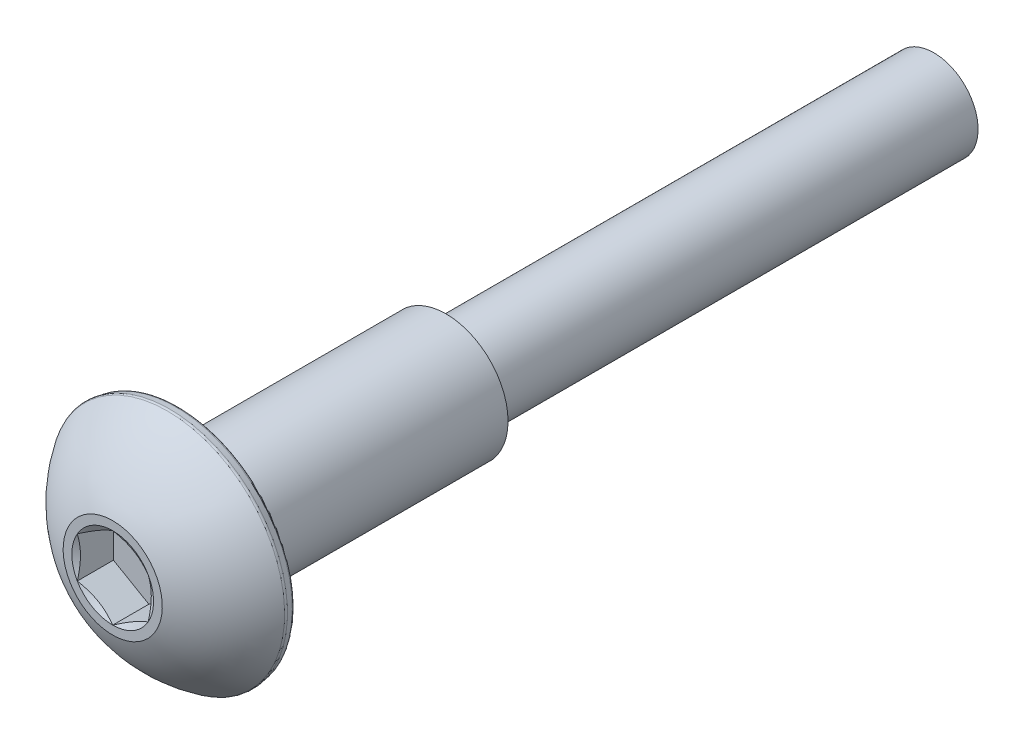
ISO-10303-21;
HEADER;
FILE_DESCRIPTION(('STEP AP214'),'2;1');
FILE_NAME('part.step','',(''),(''),'','','');
FILE_SCHEMA(('AUTOMOTIVE_DESIGN { 1 0 10303 214 1 1 1 1 }'));
ENDSEC;
DATA;
#1=APPLICATION_CONTEXT('core data for automotive mechanical design processes');
#2=APPLICATION_PROTOCOL_DEFINITION('international standard','automotive_design',2000,#1);
#3=PRODUCT_CONTEXT('',#1,'mechanical');
#4=PRODUCT('Part','Part','',(#3));
#5=PRODUCT_RELATED_PRODUCT_CATEGORY('part','',(#4));
#6=PRODUCT_DEFINITION_FORMATION('','',#4);
#7=PRODUCT_DEFINITION_CONTEXT('part definition',#1,'design');
#8=PRODUCT_DEFINITION('design','',#6,#7);
#9=PRODUCT_DEFINITION_SHAPE('','',#8);
#10=(LENGTH_UNIT() NAMED_UNIT(*) SI_UNIT(.MILLI.,.METRE.));
#11=(NAMED_UNIT(*) PLANE_ANGLE_UNIT() SI_UNIT($,.RADIAN.));
#12=(NAMED_UNIT(*) SI_UNIT($,.STERADIAN.) SOLID_ANGLE_UNIT());
#13=UNCERTAINTY_MEASURE_WITH_UNIT(LENGTH_MEASURE(1.E-05),#10,'distance_accuracy_value','');
#14=(GEOMETRIC_REPRESENTATION_CONTEXT(3) GLOBAL_UNCERTAINTY_ASSIGNED_CONTEXT((#13)) GLOBAL_UNIT_ASSIGNED_CONTEXT((#10,
#11,#12)) REPRESENTATION_CONTEXT('',''));
#15=CARTESIAN_POINT('',(0.,0.,0.));
#16=DIRECTION('',(0.,0.,1.));
#17=DIRECTION('',(1.,0.,0.));
#18=AXIS2_PLACEMENT_3D('',#15,#16,#17);
#19=CARTESIAN_POINT('',(0.,0.,13.8049));
#20=DIRECTION('',(0.,0.,1.));
#21=DIRECTION('',(1.,0.,0.));
#22=AXIS2_PLACEMENT_3D('',#19,#20,#21);
#23=CYLINDRICAL_SURFACE('',#22,2.0828);
#24=CARTESIAN_POINT('',(0.,0.,11.5091740419683));
#25=DIRECTION('',(0.,0.,1.));
#26=DIRECTION('',(1.,0.,0.));
#27=AXIS2_PLACEMENT_3D('',#24,#25,#26);
#28=CIRCLE('',#27,2.0828);
#29=CARTESIAN_POINT('',(2.0828,0.,11.5091740419683));
#30=VERTEX_POINT('',#29);
#31=EDGE_CURVE('E12',#30,#30,#28,.F.);
#32=ORIENTED_EDGE('',*,*,#31,.T.);
#33=EDGE_LOOP('',(#32));
#34=FACE_BOUND('',#33,.T.);
#35=CARTESIAN_POINT('',(0.,0.,2.5951));
#36=DIRECTION('',(0.,0.,-1.));
#37=DIRECTION('',(-1.,0.,0.));
#38=AXIS2_PLACEMENT_3D('',#35,#36,#37);
#39=CIRCLE('',#38,2.0828);
#40=CARTESIAN_POINT('',(-2.0828,0.,2.5951));
#41=VERTEX_POINT('',#40);
#42=EDGE_CURVE('E52',#41,#41,#39,.T.);
#43=ORIENTED_EDGE('',*,*,#42,.F.);
#44=EDGE_LOOP('',(#43));
#45=FACE_BOUND('',#44,.T.);
#46=ADVANCED_FACE('F48',(#34,#45),#23,.T.);
#47=CARTESIAN_POINT('',(0.,0.,11.5951));
#48=DIRECTION('',(0.,0.,1.));
#49=DIRECTION('',(-1.,0.,0.));
#50=AXIS2_PLACEMENT_3D('',#47,#48,#49);
#51=CONICAL_SURFACE('',#50,2.16872595803173,0.78539816339745);
#52=CARTESIAN_POINT('',(0.,0.,11.5951));
#53=DIRECTION('',(0.,0.,-1.));
#54=DIRECTION('',(-1.,0.,0.));
#55=AXIS2_PLACEMENT_3D('',#52,#53,#54);
#56=CIRCLE('',#55,2.16872595803173);
#57=CARTESIAN_POINT('',(-2.16872595803173,0.,11.5951));
#58=VERTEX_POINT('',#57);
#59=EDGE_CURVE('E300',#58,#58,#56,.T.);
#60=ORIENTED_EDGE('',*,*,#59,.T.);
#61=EDGE_LOOP('',(#60));
#62=FACE_BOUND('',#61,.T.);
#63=ORIENTED_EDGE('',*,*,#31,.F.);
#64=EDGE_LOOP('',(#63));
#65=FACE_BOUND('',#64,.T.);
#66=ADVANCED_FACE('F212',(#62,#65),#51,.T.);
#67=CARTESIAN_POINT('',(3.81124077745579,0.,11.5951));
#68=DIRECTION('',(0.,0.,-1.));
#69=DIRECTION('',(-1.,0.,0.));
#70=AXIS2_PLACEMENT_3D('',#67,#68,#69);
#71=PLANE('',#70);
#72=ORIENTED_EDGE('',*,*,#59,.F.);
#73=EDGE_LOOP('',(#72));
#74=FACE_BOUND('',#73,.T.);
#75=CARTESIAN_POINT('',(0.,0.,11.5951));
#76=DIRECTION('',(0.,0.,1.));
#77=DIRECTION('',(1.,0.,0.));
#78=AXIS2_PLACEMENT_3D('',#75,#76,#77);
#79=CIRCLE('',#78,3.81124077745579);
#80=CARTESIAN_POINT('',(3.81124077745579,0.,11.5951));
#81=VERTEX_POINT('',#80);
#82=EDGE_CURVE('E297',#81,#81,#79,.F.);
#83=ORIENTED_EDGE('',*,*,#82,.T.);
#84=EDGE_LOOP('',(#83));
#85=FACE_BOUND('',#84,.T.);
#86=ADVANCED_FACE('F50',(#74,#85),#71,.T.);
#87=CARTESIAN_POINT('',(0.,0.,12.58951));
#88=DIRECTION('',(0.,0.,1.));
#89=DIRECTION('',(1.,0.,0.));
#90=AXIS2_PLACEMENT_3D('',#87,#88,#89);
#91=PLANE('',#90);
#92=DIRECTION('',(0.,-1.,0.));
#93=VECTOR('',#92,1.);
#94=CARTESIAN_POINT('',(-1.190625,0.687407664253899,12.58951));
#95=LINE('',#94,#93);
#96=CARTESIAN_POINT('',(-1.190625,0.687407664253899,12.58951));
#97=VERTEX_POINT('',#96);
#98=CARTESIAN_POINT('',(-1.190625,-0.687407664253897,12.58951));
#99=VERTEX_POINT('',#98);
#100=EDGE_CURVE('E284',#97,#99,#95,.T.);
#101=ORIENTED_EDGE('',*,*,#100,.T.);
#102=DIRECTION('',(0.866025403784439,-0.5,0.));
#103=VECTOR('',#102,1.);
#104=CARTESIAN_POINT('',(-1.190625,-0.687407664253897,12.58951));
#105=LINE('',#104,#103);
#106=CARTESIAN_POINT('',(0.,-1.37481532850779,12.58951));
#107=VERTEX_POINT('',#106);
#108=EDGE_CURVE('E254',#99,#107,#105,.T.);
#109=ORIENTED_EDGE('',*,*,#108,.T.);
#110=DIRECTION('',(0.866025403784439,0.5,0.));
#111=VECTOR('',#110,1.);
#112=CARTESIAN_POINT('',(0.,-1.37481532850779,12.58951));
#113=LINE('',#112,#111);
#114=CARTESIAN_POINT('',(1.190625,-0.687407664253896,12.58951));
#115=VERTEX_POINT('',#114);
#116=EDGE_CURVE('E282',#107,#115,#113,.T.);
#117=ORIENTED_EDGE('',*,*,#116,.T.);
#118=DIRECTION('',(0.,1.,0.));
#119=VECTOR('',#118,1.);
#120=CARTESIAN_POINT('',(1.190625,-0.687407664253896,12.58951));
#121=LINE('',#120,#119);
#122=CARTESIAN_POINT('',(1.190625,0.6874076642539,12.58951));
#123=VERTEX_POINT('',#122);
#124=EDGE_CURVE('E270',#115,#123,#121,.T.);
#125=ORIENTED_EDGE('',*,*,#124,.T.);
#126=DIRECTION('',(-0.866025403784439,0.5,0.));
#127=VECTOR('',#126,1.);
#128=CARTESIAN_POINT('',(1.190625,0.6874076642539,12.58951));
#129=LINE('',#128,#127);
#130=CARTESIAN_POINT('',(0.,1.3748153285078,12.58951));
#131=VERTEX_POINT('',#130);
#132=EDGE_CURVE('E279',#123,#131,#129,.T.);
#133=ORIENTED_EDGE('',*,*,#132,.T.);
#134=DIRECTION('',(-0.866025403784438,-0.5,0.));
#135=VECTOR('',#134,1.);
#136=CARTESIAN_POINT('',(0.,1.3748153285078,12.58951));
#137=LINE('',#136,#135);
#138=EDGE_CURVE('E138',#131,#97,#137,.T.);
#139=ORIENTED_EDGE('',*,*,#138,.T.);
#140=EDGE_LOOP('',(#101,#109,#117,#125,#133,#139));
#141=FACE_BOUND('',#140,.T.);
#142=ADVANCED_FACE('F166',(#141),#91,.T.);
#143=CARTESIAN_POINT('',(-1.190625,-0.687407664253897,12.58951));
#144=DIRECTION('',(-0.5,-0.866025403784439,0.));
#145=DIRECTION('',(0.866025403784439,-0.5,0.));
#146=AXIS2_PLACEMENT_3D('',#143,#144,#145);
#147=PLANE('',#146);
#148=DIRECTION('',(0.,0.,1.));
#149=VECTOR('',#148,1.);
#150=CARTESIAN_POINT('',(-1.190625,-0.687407664253897,12.58951));
#151=LINE('',#150,#149);
#152=CARTESIAN_POINT('',(-1.190625,-0.687407664253895,13.8049));
#153=VERTEX_POINT('',#152);
#154=EDGE_CURVE('E71',#99,#153,#151,.T.);
#155=ORIENTED_EDGE('',*,*,#154,.T.);
#156=CARTESIAN_POINT('',(-1.190825,-0.687292194200059,13.8049666750649));
#157=CARTESIAN_POINT('',(-1.13850086640794,-0.717501546814547,13.7875158911719));
#158=CARTESIAN_POINT('',(-1.08572507911365,-0.747971661815601,13.7716444802597));
#159=CARTESIAN_POINT('',(-0.979259451985808,-0.809439620297303,13.7439394897393));
#160=CARTESIAN_POINT('',(-0.92556771904163,-0.840438556765882,13.7321157133569));
#161=CARTESIAN_POINT('',(-0.818849729284477,-0.902052216879549,13.7137085267766));
#162=CARTESIAN_POINT('',(-0.765839901547055,-0.932657455193446,13.7070026367973));
#163=CARTESIAN_POINT('',(-0.659570550745402,-0.994012093485387,13.6989941608559));
#164=CARTESIAN_POINT('',(-0.606311414481165,-1.02476127014435,13.6976849464003));
#165=CARTESIAN_POINT('',(-0.506776071312109,-1.08222802731689,13.7003944946182));
#166=CARTESIAN_POINT('',(-0.460485037506222,-1.10895416814578,13.7037479670539));
#167=CARTESIAN_POINT('',(-0.368204585679171,-1.16223231184907,13.7143808803557));
#168=CARTESIAN_POINT('',(-0.322215487336752,-1.18878413015685,13.7216639607648));
#169=CARTESIAN_POINT('',(-0.22974444840945,-1.24217230937378,13.7398728190617));
#170=CARTESIAN_POINT('',(-0.183274224005286,-1.26900190594282,13.7508758583194));
#171=CARTESIAN_POINT('',(-0.091027254583136,-1.32226071857063,13.7758490907767));
#172=CARTESIAN_POINT('',(-0.0452493258233877,-1.34869061806301,13.7898134081649));
#173=CARTESIAN_POINT('',(0.000200000000000575,-1.37493079856163,13.8049666750649));
#174=B_SPLINE_CURVE_WITH_KNOTS('',3,(#156,#157,#158,#159,#160,#161,#162,#163,#164,#165,#166,
#167,#168,#169,#170,#171,#172,#173),.UNSPECIFIED.,.F.,.F.,(4,2,2,2,2,2,2,2,4),(0.,
0.188739408275265,0.377932755052259,0.562442610563904,0.746725773280442,0.907244981861691,
1.06791311672804,1.23214725548008,1.39605851764637),.UNSPECIFIED.);
#175=CARTESIAN_POINT('',(0.,-1.3748153285078,13.8049));
#176=VERTEX_POINT('',#175);
#177=EDGE_CURVE('E171',#153,#176,#174,.T.);
#178=ORIENTED_EDGE('',*,*,#177,.T.);
#179=DIRECTION('',(0.,0.,1.));
#180=VECTOR('',#179,1.);
#181=CARTESIAN_POINT('',(0.,-1.37481532850779,12.58951));
#182=LINE('',#181,#180);
#183=EDGE_CURVE('E256',#107,#176,#182,.T.);
#184=ORIENTED_EDGE('',*,*,#183,.F.);
#185=ORIENTED_EDGE('',*,*,#108,.F.);
#186=EDGE_LOOP('',(#155,#178,#184,#185));
#187=FACE_BOUND('',#186,.T.);
#188=ADVANCED_FACE('F208',(#187),#147,.F.);
#189=CARTESIAN_POINT('',(0.,-1.37481532850779,12.58951));
#190=DIRECTION('',(0.5,-0.866025403784438,0.));
#191=DIRECTION('',(0.866025403784439,0.5,0.));
#192=AXIS2_PLACEMENT_3D('',#189,#190,#191);
#193=PLANE('',#192);
#194=ORIENTED_EDGE('',*,*,#183,.T.);
#195=CARTESIAN_POINT('',(-0.000199999999999549,-1.37493079856163,13.8049666750649));
#196=CARTESIAN_POINT('',(0.0521241335920579,-1.34472144594714,13.7875158911719));
#197=CARTESIAN_POINT('',(0.10489992088635,-1.31425133094609,13.7716444802597));
#198=CARTESIAN_POINT('',(0.211365548014192,-1.25278337246439,13.7439394897393));
#199=CARTESIAN_POINT('',(0.265057280958371,-1.22178443599581,13.7321157133569));
#200=CARTESIAN_POINT('',(0.371775270715523,-1.16017077588214,13.7137085267766));
#201=CARTESIAN_POINT('',(0.424785098452945,-1.12956553756825,13.7070026367973));
#202=CARTESIAN_POINT('',(0.531054449254598,-1.0682108992763,13.6989941608559));
#203=CARTESIAN_POINT('',(0.584313585518835,-1.03746172261734,13.6976849464003));
#204=CARTESIAN_POINT('',(0.683848928687891,-0.979994965444803,13.7003944946182));
#205=CARTESIAN_POINT('',(0.730139962493778,-0.953268824615909,13.7037479670539));
#206=CARTESIAN_POINT('',(0.822420414320829,-0.899990680912621,13.7143808803557));
#207=CARTESIAN_POINT('',(0.868409512663248,-0.873438862604837,13.7216639607648));
#208=CARTESIAN_POINT('',(0.960880551590549,-0.820050683387915,13.7398728190617));
#209=CARTESIAN_POINT('',(1.00735077599471,-0.793221086818868,13.7508758583194));
#210=CARTESIAN_POINT('',(1.09959774541686,-0.739962274191063,13.7758490907767));
#211=CARTESIAN_POINT('',(1.14537567417661,-0.713532374698679,13.7898134081649));
#212=CARTESIAN_POINT('',(1.190825,-0.687292194200059,13.8049666750649));
#213=B_SPLINE_CURVE_WITH_KNOTS('',3,(#195,#196,#197,#198,#199,#200,#201,#202,#203,#204,#205,
#206,#207,#208,#209,#210,#211,#212),.UNSPECIFIED.,.F.,.F.,(4,2,2,2,2,2,2,2,4),(0.,
0.188739408275265,0.377932755052259,0.562442610563904,0.746725773280443,0.907244981861691,
1.06791311672804,1.23214725548008,1.39605851764637),.UNSPECIFIED.);
#214=CARTESIAN_POINT('',(1.190625,-0.687407664253895,13.8049));
#215=VERTEX_POINT('',#214);
#216=EDGE_CURVE('E115',#176,#215,#213,.T.);
#217=ORIENTED_EDGE('',*,*,#216,.T.);
#218=DIRECTION('',(0.,0.,1.));
#219=VECTOR('',#218,1.);
#220=CARTESIAN_POINT('',(1.190625,-0.687407664253896,12.58951));
#221=LINE('',#220,#219);
#222=EDGE_CURVE('E267',#115,#215,#221,.T.);
#223=ORIENTED_EDGE('',*,*,#222,.F.);
#224=ORIENTED_EDGE('',*,*,#116,.F.);
#225=EDGE_LOOP('',(#194,#217,#223,#224));
#226=FACE_BOUND('',#225,.T.);
#227=ADVANCED_FACE('F158',(#226),#193,.F.);
#228=CARTESIAN_POINT('',(1.190625,-0.687407664253896,12.58951));
#229=DIRECTION('',(1.,0.,0.));
#230=DIRECTION('',(0.,0.,-1.));
#231=AXIS2_PLACEMENT_3D('',#228,#229,#230);
#232=PLANE('',#231);
#233=ORIENTED_EDGE('',*,*,#222,.T.);
#234=CARTESIAN_POINT('',(1.190625,-1.78015716020704,14.2476163906554));
#235=CARTESIAN_POINT('',(1.190625,-1.72874189185983,14.2229488309547));
#236=CARTESIAN_POINT('',(1.190625,-1.6772013389923,14.1985381585061));
#237=CARTESIAN_POINT('',(1.190625,-1.57380296646993,14.1503745833137));
#238=CARTESIAN_POINT('',(1.190625,-1.52194509174156,14.126621798946));
#239=CARTESIAN_POINT('',(1.190625,-1.41754804002314,14.0797852949331));
#240=CARTESIAN_POINT('',(1.190625,-1.36500663843256,14.0567065078844));
#241=CARTESIAN_POINT('',(1.190625,-1.25948270070628,14.0115892442043));
#242=CARTESIAN_POINT('',(1.190625,-1.2065001876767,13.9895507134811));
#243=CARTESIAN_POINT('',(1.190625,-1.04398470146779,13.9242514369833));
#244=CARTESIAN_POINT('',(1.190625,-0.933604354597384,13.8830585999003));
#245=CARTESIAN_POINT('',(1.190625,-0.710006074690722,13.8097509566151));
#246=CARTESIAN_POINT('',(1.190625,-0.596796359427704,13.7776125823328));
#247=CARTESIAN_POINT('',(1.190625,-0.424696051876902,13.7403391876118));
#248=CARTESIAN_POINT('',(1.190625,-0.367003246478022,13.7297418918806));
#249=CARTESIAN_POINT('',(1.190625,-0.250970459440639,13.7129152301313));
#250=CARTESIAN_POINT('',(1.190625,-0.192630521807337,13.7066855689398));
#251=CARTESIAN_POINT('',(1.190625,-0.0763262925494509,13.6991712860207));
#252=CARTESIAN_POINT('',(1.190625,-0.0183658752538224,13.697828309312));
#253=CARTESIAN_POINT('',(1.190625,0.0974591062929192,13.7000451833237));
#254=CARTESIAN_POINT('',(1.190625,0.155323664386659,13.703605337629));
#255=CARTESIAN_POINT('',(1.190625,0.298095905598661,13.7181253650142));
#256=CARTESIAN_POINT('',(1.190625,0.382726930762759,13.731806337346));
#257=CARTESIAN_POINT('',(1.190625,0.550343213783404,13.7670856083292));
#258=CARTESIAN_POINT('',(1.190625,0.633326360497146,13.7886934492585));
#259=CARTESIAN_POINT('',(1.190625,0.757436785616911,13.8256049239269));
#260=CARTESIAN_POINT('',(1.190625,0.79920560365277,13.8388308547387));
#261=CARTESIAN_POINT('',(1.190625,0.882308453068416,13.8665061905507));
#262=CARTESIAN_POINT('',(1.190625,0.923642737930447,13.8809548320084));
#263=CARTESIAN_POINT('',(1.190625,1.00593175891306,13.9108657525345));
#264=CARTESIAN_POINT('',(1.190625,1.04688656247483,13.92632784739));
#265=CARTESIAN_POINT('',(1.190625,1.12847345966589,13.9580984272925));
#266=CARTESIAN_POINT('',(1.190625,1.1691054974264,13.9744070553403));
#267=CARTESIAN_POINT('',(1.190625,1.27282063071651,14.0170802730663));
#268=CARTESIAN_POINT('',(1.190625,1.33569634158372,14.043948362068));
#269=CARTESIAN_POINT('',(1.190625,1.46087997208419,14.0989797400025));
#270=CARTESIAN_POINT('',(1.190625,1.52318784876136,14.1271431259645));
#271=CARTESIAN_POINT('',(1.190625,1.70944892885062,14.2131196214873));
#272=CARTESIAN_POINT('',(1.190625,1.83271877672913,14.2724102543263));
#273=CARTESIAN_POINT('',(1.190625,2.07820533773844,14.3934781590678));
#274=CARTESIAN_POINT('',(1.190625,2.20042056990702,14.4552583983021));
#275=CARTESIAN_POINT('',(1.190625,2.44401368474694,14.5804074444787));
#276=CARTESIAN_POINT('',(1.190625,2.56539167137775,14.6437760494975));
#277=CARTESIAN_POINT('',(1.190625,2.79613899431499,14.7655747277329));
#278=CARTESIAN_POINT('',(1.190625,2.90556045463822,14.8239063947491));
#279=CARTESIAN_POINT('',(1.190625,3.12405139947394,14.9412343567713));
#280=CARTESIAN_POINT('',(1.190625,3.23312087076723,15.0002306763737));
#281=CARTESIAN_POINT('',(1.190625,3.45071155612091,15.1185705740664));
#282=CARTESIAN_POINT('',(1.190625,3.55923345906017,15.1779128872124));
#283=CARTESIAN_POINT('',(1.190625,3.77605786024419,15.2969837446499));
#284=CARTESIAN_POINT('',(1.190625,3.88436036967376,15.3567122685663));
#285=CARTESIAN_POINT('',(1.190625,3.99258405604319,15.4165824167874));
#286=B_SPLINE_CURVE_WITH_KNOTS('',3,(#234,#235,#236,#237,#238,#239,#240,#241,#242,#243,#244,
#245,#246,#247,#248,#249,#250,#251,#252,#253,#254,#255,#256,#257,#258,#259,#260,#261,#262,#263,
#264,#265,#266,#267,#268,#269,#270,#271,#272,#273,#274,#275,#276,#277,#278,#279,#280,#281,#282,
#283,#284,#285),.UNSPECIFIED.,.F.,.F.,(4,2,2,2,2,2,2,2,2,2,2,2,2,2,2,2,2,2,2,2,2,2,2,2,2,4),(0.,
0.171081312800698,0.342193211477216,0.514343080996252,0.686483989069503,1.03974142261425,
1.39207067467283,1.56790731618693,1.7437320731725,1.91745017490202,2.09117903313408,
2.34784044559531,2.60481184357443,2.73623569960085,2.86757808297636,2.99889665842932,
3.13023748956819,3.33534372136274,3.5404653425514,3.95077633549906,4.36159174218368,
4.7723551855675,5.14434822317799,5.51635507236915,5.8874157094349,6.25845692794643),.UNSPECIFIED.);
#287=CARTESIAN_POINT('',(1.190625,0.687407664253901,13.8049));
#288=VERTEX_POINT('',#287);
#289=EDGE_CURVE('E133',#215,#288,#286,.T.);
#290=ORIENTED_EDGE('',*,*,#289,.T.);
#291=DIRECTION('',(0.,0.,1.));
#292=VECTOR('',#291,1.);
#293=CARTESIAN_POINT('',(1.190625,0.6874076642539,12.58951));
#294=LINE('',#293,#292);
#295=EDGE_CURVE('E132',#123,#288,#294,.T.);
#296=ORIENTED_EDGE('',*,*,#295,.F.);
#297=ORIENTED_EDGE('',*,*,#124,.F.);
#298=EDGE_LOOP('',(#233,#290,#296,#297));
#299=FACE_BOUND('',#298,.T.);
#300=ADVANCED_FACE('F202',(#299),#232,.F.);
#301=CARTESIAN_POINT('',(1.190625,0.6874076642539,12.58951));
#302=DIRECTION('',(0.5,0.866025403784439,0.));
#303=DIRECTION('',(-0.866025403784439,0.5,0.));
#304=AXIS2_PLACEMENT_3D('',#301,#302,#303);
#305=PLANE('',#304);
#306=ORIENTED_EDGE('',*,*,#295,.T.);
#307=CARTESIAN_POINT('',(1.190825,0.687292194200062,13.8049666750649));
#308=CARTESIAN_POINT('',(1.13850086640794,0.717501546814551,13.7875158911719));
#309=CARTESIAN_POINT('',(1.08572507911365,0.747971661815605,13.7716444802597));
#310=CARTESIAN_POINT('',(0.979259451985807,0.809439620297307,13.7439394897393));
#311=CARTESIAN_POINT('',(0.925567719041629,0.840438556765886,13.7321157133569));
#312=CARTESIAN_POINT('',(0.818849729284476,0.902052216879554,13.7137085267766));
#313=CARTESIAN_POINT('',(0.765839901547054,0.93265745519345,13.7070026367973));
#314=CARTESIAN_POINT('',(0.659570550745401,0.994012093485391,13.6989941608559));
#315=CARTESIAN_POINT('',(0.606311414481164,1.02476127014436,13.6976849464003));
#316=CARTESIAN_POINT('',(0.506776071312108,1.08222802731689,13.7003944946182));
#317=CARTESIAN_POINT('',(0.460485037506221,1.10895416814579,13.7037479670539));
#318=CARTESIAN_POINT('',(0.368204585679171,1.16223231184907,13.7143808803557));
#319=CARTESIAN_POINT('',(0.322215487336752,1.18878413015686,13.7216639607648));
#320=CARTESIAN_POINT('',(0.22974444840945,1.24217230937378,13.7398728190617));
#321=CARTESIAN_POINT('',(0.183274224005285,1.26900190594283,13.7508758583194));
#322=CARTESIAN_POINT('',(0.0910272545831355,1.32226071857063,13.7758490907767));
#323=CARTESIAN_POINT('',(0.0452493258233872,1.34869061806302,13.7898134081649));
#324=CARTESIAN_POINT('',(-0.00020000000000053,1.37493079856164,13.8049666750649));
#325=B_SPLINE_CURVE_WITH_KNOTS('',3,(#307,#308,#309,#310,#311,#312,#313,#314,#315,#316,#317,
#318,#319,#320,#321,#322,#323,#324),.UNSPECIFIED.,.F.,.F.,(4,2,2,2,2,2,2,2,4),(0.,
0.188739408275265,0.37793275505226,0.562442610563906,0.746725773280444,0.907244981861692,
1.06791311672804,1.23214725548008,1.39605851764637),.UNSPECIFIED.);
#326=CARTESIAN_POINT('',(0.,1.3748153285078,13.8049));
#327=VERTEX_POINT('',#326);
#328=EDGE_CURVE('E109',#288,#327,#325,.T.);
#329=ORIENTED_EDGE('',*,*,#328,.T.);
#330=DIRECTION('',(0.,0.,1.));
#331=VECTOR('',#330,1.);
#332=CARTESIAN_POINT('',(0.,1.3748153285078,12.58951));
#333=LINE('',#332,#331);
#334=EDGE_CURVE('E130',#131,#327,#333,.T.);
#335=ORIENTED_EDGE('',*,*,#334,.F.);
#336=ORIENTED_EDGE('',*,*,#132,.F.);
#337=EDGE_LOOP('',(#306,#329,#335,#336));
#338=FACE_BOUND('',#337,.T.);
#339=ADVANCED_FACE('F128',(#338),#305,.F.);
#340=CARTESIAN_POINT('',(0.,1.3748153285078,12.58951));
#341=DIRECTION('',(-0.5,0.866025403784438,0.));
#342=DIRECTION('',(-0.866025403784438,-0.5,0.));
#343=AXIS2_PLACEMENT_3D('',#340,#341,#342);
#344=PLANE('',#343);
#345=ORIENTED_EDGE('',*,*,#334,.T.);
#346=CARTESIAN_POINT('',(0.000199999999999587,1.37493079856164,13.8049666750649));
#347=CARTESIAN_POINT('',(-0.0521241335920582,1.34472144594715,13.7875158911719));
#348=CARTESIAN_POINT('',(-0.104899920886351,1.31425133094609,13.7716444802597));
#349=CARTESIAN_POINT('',(-0.211365548014193,1.25278337246439,13.7439394897393));
#350=CARTESIAN_POINT('',(-0.265057280958371,1.22178443599581,13.7321157133569));
#351=CARTESIAN_POINT('',(-0.371775270715524,1.16017077588214,13.7137085267766));
#352=CARTESIAN_POINT('',(-0.424785098452946,1.12956553756825,13.7070026367973));
#353=CARTESIAN_POINT('',(-0.531054449254599,1.06821089927631,13.6989941608559));
#354=CARTESIAN_POINT('',(-0.584313585518836,1.03746172261734,13.6976849464003));
#355=CARTESIAN_POINT('',(-0.683848928687892,0.979994965444806,13.7003944946182));
#356=CARTESIAN_POINT('',(-0.730139962493779,0.953268824615912,13.7037479670539));
#357=CARTESIAN_POINT('',(-0.822420414320829,0.899990680912624,13.7143808803557));
#358=CARTESIAN_POINT('',(-0.868409512663248,0.87343886260484,13.7216639607648));
#359=CARTESIAN_POINT('',(-0.96088055159055,0.820050683387918,13.7398728190617));
#360=CARTESIAN_POINT('',(-1.00735077599471,0.793221086818871,13.7508758583194));
#361=CARTESIAN_POINT('',(-1.09959774541686,0.739962274191066,13.7758490907767));
#362=CARTESIAN_POINT('',(-1.14537567417661,0.713532374698682,13.7898134081649));
#363=CARTESIAN_POINT('',(-1.190825,0.687292194200061,13.8049666750649));
#364=B_SPLINE_CURVE_WITH_KNOTS('',3,(#346,#347,#348,#349,#350,#351,#352,#353,#354,#355,#356,
#357,#358,#359,#360,#361,#362,#363),.UNSPECIFIED.,.F.,.F.,(4,2,2,2,2,2,2,2,4),(0.,
0.188739408275266,0.37793275505226,0.562442610563905,0.746725773280444,0.907244981861692,
1.06791311672804,1.23214725548008,1.39605851764637),.UNSPECIFIED.);
#365=CARTESIAN_POINT('',(-1.190625,0.687407664253899,13.8049));
#366=VERTEX_POINT('',#365);
#367=EDGE_CURVE('E120',#327,#366,#364,.T.);
#368=ORIENTED_EDGE('',*,*,#367,.T.);
#369=DIRECTION('',(0.,0.,1.));
#370=VECTOR('',#369,1.);
#371=CARTESIAN_POINT('',(-1.190625,0.687407664253899,12.58951));
#372=LINE('',#371,#370);
#373=EDGE_CURVE('E139',#97,#366,#372,.T.);
#374=ORIENTED_EDGE('',*,*,#373,.F.);
#375=ORIENTED_EDGE('',*,*,#138,.F.);
#376=EDGE_LOOP('',(#345,#368,#374,#375));
#377=FACE_BOUND('',#376,.T.);
#378=ADVANCED_FACE('F136',(#377),#344,.F.);
#379=CARTESIAN_POINT('',(-1.190625,0.687407664253899,12.58951));
#380=DIRECTION('',(-1.,0.,0.));
#381=DIRECTION('',(0.,-1.,0.));
#382=AXIS2_PLACEMENT_3D('',#379,#380,#381);
#383=PLANE('',#382);
#384=ORIENTED_EDGE('',*,*,#373,.T.);
#385=CARTESIAN_POINT('',(-1.190625,-1.78015716020704,14.2476163906554));
#386=CARTESIAN_POINT('',(-1.190625,-1.72874189185983,14.2229488309547));
#387=CARTESIAN_POINT('',(-1.190625,-1.6772013389923,14.1985381585061));
#388=CARTESIAN_POINT('',(-1.190625,-1.57380296646993,14.1503745833137));
#389=CARTESIAN_POINT('',(-1.190625,-1.52194509174156,14.126621798946));
#390=CARTESIAN_POINT('',(-1.190625,-1.41754804002314,14.0797852949331));
#391=CARTESIAN_POINT('',(-1.190625,-1.36500663843256,14.0567065078844));
#392=CARTESIAN_POINT('',(-1.190625,-1.25948270070628,14.0115892442043));
#393=CARTESIAN_POINT('',(-1.190625,-1.2065001876767,13.9895507134811));
#394=CARTESIAN_POINT('',(-1.190625,-1.04398470146779,13.9242514369833));
#395=CARTESIAN_POINT('',(-1.190625,-0.933604354597384,13.8830585999003));
#396=CARTESIAN_POINT('',(-1.190625,-0.710006074690722,13.8097509566151));
#397=CARTESIAN_POINT('',(-1.190625,-0.596796359427703,13.7776125823328));
#398=CARTESIAN_POINT('',(-1.190625,-0.424696051876902,13.7403391876118));
#399=CARTESIAN_POINT('',(-1.190625,-0.367003246478021,13.7297418918806));
#400=CARTESIAN_POINT('',(-1.190625,-0.250970459440639,13.7129152301313));
#401=CARTESIAN_POINT('',(-1.190625,-0.192630521807337,13.7066855689398));
#402=CARTESIAN_POINT('',(-1.190625,-0.0763262925494507,13.6991712860207));
#403=CARTESIAN_POINT('',(-1.190625,-0.0183658752538222,13.697828309312));
#404=CARTESIAN_POINT('',(-1.190625,0.0974591062929192,13.7000451833237));
#405=CARTESIAN_POINT('',(-1.190625,0.155323664386659,13.703605337629));
#406=CARTESIAN_POINT('',(-1.190625,0.298095905598661,13.7181253650142));
#407=CARTESIAN_POINT('',(-1.190625,0.382726930762759,13.731806337346));
#408=CARTESIAN_POINT('',(-1.190625,0.550343213783404,13.7670856083292));
#409=CARTESIAN_POINT('',(-1.190625,0.633326360497146,13.7886934492585));
#410=CARTESIAN_POINT('',(-1.190625,0.757436785616911,13.8256049239269));
#411=CARTESIAN_POINT('',(-1.190625,0.79920560365277,13.8388308547387));
#412=CARTESIAN_POINT('',(-1.190625,0.882308453068416,13.8665061905507));
#413=CARTESIAN_POINT('',(-1.190625,0.923642737930447,13.8809548320084));
#414=CARTESIAN_POINT('',(-1.190625,1.00593175891306,13.9108657525345));
#415=CARTESIAN_POINT('',(-1.190625,1.04688656247483,13.92632784739));
#416=CARTESIAN_POINT('',(-1.190625,1.12847345966589,13.9580984272925));
#417=CARTESIAN_POINT('',(-1.190625,1.1691054974264,13.9744070553403));
#418=CARTESIAN_POINT('',(-1.190625,1.27282063071651,14.0170802730663));
#419=CARTESIAN_POINT('',(-1.190625,1.33569634158372,14.043948362068));
#420=CARTESIAN_POINT('',(-1.190625,1.4608799720842,14.0989797400025));
#421=CARTESIAN_POINT('',(-1.190625,1.52318784876136,14.1271431259645));
#422=CARTESIAN_POINT('',(-1.190625,1.70944892885062,14.2131196214873));
#423=CARTESIAN_POINT('',(-1.190625,1.83271877672913,14.2724102543263));
#424=CARTESIAN_POINT('',(-1.190625,2.07820533773844,14.3934781590678));
#425=CARTESIAN_POINT('',(-1.190625,2.20042056990702,14.4552583983021));
#426=CARTESIAN_POINT('',(-1.190625,2.44401368474694,14.5804074444787));
#427=CARTESIAN_POINT('',(-1.190625,2.56539167137774,14.6437760494975));
#428=CARTESIAN_POINT('',(-1.190625,2.79613899431499,14.7655747277329));
#429=CARTESIAN_POINT('',(-1.190625,2.90556045463821,14.8239063947491));
#430=CARTESIAN_POINT('',(-1.190625,3.12405139947394,14.9412343567713));
#431=CARTESIAN_POINT('',(-1.190625,3.23312087076723,15.0002306763737));
#432=CARTESIAN_POINT('',(-1.190625,3.45071155612091,15.1185705740664));
#433=CARTESIAN_POINT('',(-1.190625,3.55923345906017,15.1779128872124));
#434=CARTESIAN_POINT('',(-1.190625,3.77605786024419,15.2969837446499));
#435=CARTESIAN_POINT('',(-1.190625,3.88436036967376,15.3567122685663));
#436=CARTESIAN_POINT('',(-1.190625,3.99258405604319,15.4165824167874));
#437=B_SPLINE_CURVE_WITH_KNOTS('',3,(#385,#386,#387,#388,#389,#390,#391,#392,#393,#394,#395,
#396,#397,#398,#399,#400,#401,#402,#403,#404,#405,#406,#407,#408,#409,#410,#411,#412,#413,#414,
#415,#416,#417,#418,#419,#420,#421,#422,#423,#424,#425,#426,#427,#428,#429,#430,#431,#432,#433,
#434,#435,#436),.UNSPECIFIED.,.F.,.F.,(4,2,2,2,2,2,2,2,2,2,2,2,2,2,2,2,2,2,2,2,2,2,2,2,2,4),(0.,
0.171081312800698,0.342193211477216,0.514343080996252,0.686483989069503,1.03974142261425,
1.39207067467283,1.56790731618693,1.7437320731725,1.91745017490202,2.09117903313408,
2.34784044559531,2.60481184357443,2.73623569960085,2.86757808297636,2.99889665842932,
3.13023748956819,3.33534372136274,3.5404653425514,3.95077633549906,4.36159174218368,
4.77235518556749,5.14434822317799,5.51635507236915,5.8874157094349,6.25845692794643),.UNSPECIFIED.);
#438=EDGE_CURVE('E124',#366,#153,#437,.F.);
#439=ORIENTED_EDGE('',*,*,#438,.T.);
#440=ORIENTED_EDGE('',*,*,#154,.F.);
#441=ORIENTED_EDGE('',*,*,#100,.F.);
#442=EDGE_LOOP('',(#384,#439,#440,#441));
#443=FACE_BOUND('',#442,.T.);
#444=ADVANCED_FACE('F199',(#443),#383,.F.);
#445=CARTESIAN_POINT('',(0.,0.,13.8049));
#446=DIRECTION('',(0.,0.,1.));
#447=DIRECTION('',(1.,0.,0.));
#448=AXIS2_PLACEMENT_3D('',#445,#446,#447);
#449=CONICAL_SURFACE('',#448,1.3748153285078,1.0471975511966);
#450=CARTESIAN_POINT('',(0.,0.,13.8049));
#451=DIRECTION('',(0.,0.,1.));
#452=DIRECTION('',(1.,0.,0.));
#453=AXIS2_PLACEMENT_3D('',#450,#451,#452);
#454=CIRCLE('',#453,1.3748153285078);
#455=EDGE_CURVE('E144',#153,#176,#454,.T.);
#456=ORIENTED_EDGE('',*,*,#455,.T.);
#457=ORIENTED_EDGE('',*,*,#177,.F.);
#458=EDGE_LOOP('',(#456,#457));
#459=FACE_BOUND('',#458,.T.);
#460=ADVANCED_FACE('F165',(#459),#449,.F.);
#461=EDGE_CURVE('E260',#176,#215,#454,.T.);
#462=ORIENTED_EDGE('',*,*,#461,.T.);
#463=ORIENTED_EDGE('',*,*,#216,.F.);
#464=EDGE_LOOP('',(#462,#463));
#465=FACE_BOUND('',#464,.T.);
#466=ADVANCED_FACE('F355',(#465),#449,.F.);
#467=EDGE_CURVE('E57',#215,#288,#454,.T.);
#468=ORIENTED_EDGE('',*,*,#467,.T.);
#469=ORIENTED_EDGE('',*,*,#289,.F.);
#470=EDGE_LOOP('',(#468,#469));
#471=FACE_BOUND('',#470,.T.);
#472=ADVANCED_FACE('F265',(#471),#449,.F.);
#473=EDGE_CURVE('E105',#288,#327,#454,.T.);
#474=ORIENTED_EDGE('',*,*,#473,.T.);
#475=ORIENTED_EDGE('',*,*,#328,.F.);
#476=EDGE_LOOP('',(#474,#475));
#477=FACE_BOUND('',#476,.T.);
#478=ADVANCED_FACE('F107',(#477),#449,.F.);
#479=EDGE_CURVE('E114',#327,#366,#454,.T.);
#480=ORIENTED_EDGE('',*,*,#479,.T.);
#481=ORIENTED_EDGE('',*,*,#367,.F.);
#482=EDGE_LOOP('',(#480,#481));
#483=FACE_BOUND('',#482,.T.);
#484=ADVANCED_FACE('F121',(#483),#449,.F.);
#485=EDGE_CURVE('E63',#366,#153,#454,.T.);
#486=ORIENTED_EDGE('',*,*,#485,.T.);
#487=ORIENTED_EDGE('',*,*,#438,.F.);
#488=EDGE_LOOP('',(#486,#487));
#489=FACE_BOUND('',#488,.T.);
#490=ADVANCED_FACE('F161',(#489),#449,.F.);
#491=CARTESIAN_POINT('',(0.,0.,13.8049));
#492=DIRECTION('',(0.,0.,-1.));
#493=DIRECTION('',(-1.,0.,0.));
#494=AXIS2_PLACEMENT_3D('',#491,#492,#493);
#495=PLANE('',#494);
#496=ORIENTED_EDGE('',*,*,#485,.F.);
#497=ORIENTED_EDGE('',*,*,#479,.F.);
#498=ORIENTED_EDGE('',*,*,#473,.F.);
#499=ORIENTED_EDGE('',*,*,#467,.F.);
#500=ORIENTED_EDGE('',*,*,#461,.F.);
#501=ORIENTED_EDGE('',*,*,#455,.F.);
#502=EDGE_LOOP('',(#496,#497,#498,#499,#500,#501));
#503=FACE_BOUND('',#502,.T.);
#504=CARTESIAN_POINT('',(0.,0.,13.8049));
#505=DIRECTION('',(0.,0.,1.));
#506=DIRECTION('',(1.,0.,0.));
#507=AXIS2_PLACEMENT_3D('',#504,#505,#506);
#508=CIRCLE('',#507,1.666875);
#509=CARTESIAN_POINT('',(0.,1.666875,13.8049));
#510=VERTEX_POINT('',#509);
#511=EDGE_CURVE('E277',#510,#510,#508,.T.);
#512=ORIENTED_EDGE('',*,*,#511,.T.);
#513=EDGE_LOOP('',(#512));
#514=FACE_BOUND('',#513,.T.);
#515=ADVANCED_FACE('F141',(#503,#514),#495,.F.);
#516=CARTESIAN_POINT('',(0.,0.,9.42593967799188));
#517=DIRECTION('',(0.,0.,1.));
#518=DIRECTION('',(0.,1.,0.));
#519=AXIS2_PLACEMENT_3D('',#516,#517,#518);
#520=SPHERICAL_SURFACE('',#519,4.68548458191321);
#521=CARTESIAN_POINT('',(0.,0.,11.9632533101823));
#522=DIRECTION('',(0.,0.,-1.));
#523=DIRECTION('',(-1.,0.,0.));
#524=AXIS2_PLACEMENT_3D('',#521,#522,#523);
#525=CIRCLE('',#524,3.93901070057534);
#526=CARTESIAN_POINT('',(0.,3.93901070057534,11.9632533101823));
#527=VERTEX_POINT('',#526);
#528=EDGE_CURVE('E287',#527,#527,#525,.F.);
#529=CARTESIAN_POINT('',(0.,3.93901070057534,11.9632533101823));
#530=CARTESIAN_POINT('',(0.,3.92223208961816,11.9893010682299));
#531=CARTESIAN_POINT('',(0.,3.90519503662693,12.0151823490733));
#532=CARTESIAN_POINT('',(0.,3.87061090971435,12.0666018773865));
#533=CARTESIAN_POINT('',(0.,3.85306383579299,12.0921401248563));
#534=CARTESIAN_POINT('',(0.,3.81746653015813,12.142863507457));
#535=CARTESIAN_POINT('',(0.,3.79941629844463,12.1680486425879));
#536=CARTESIAN_POINT('',(0.,3.7628197921601,12.218055896684));
#537=CARTESIAN_POINT('',(0.,3.74427351758908,12.2428780156492));
#538=CARTESIAN_POINT('',(0.,3.70669222132832,12.2921494667575));
#539=CARTESIAN_POINT('',(0.,3.68765719963859,12.3165987989005));
#540=CARTESIAN_POINT('',(0.,3.64910590108429,12.3651150550134));
#541=CARTESIAN_POINT('',(0.,3.62958962421973,12.3891819789832));
#542=CARTESIAN_POINT('',(0.,3.59008349562036,12.4369239471972));
#543=CARTESIAN_POINT('',(0.,3.57009364388555,12.4605989914414));
#544=CARTESIAN_POINT('',(0.,3.52964823250024,12.5075478830604));
#545=CARTESIAN_POINT('',(0.,3.50919267284975,12.5308217304352));
#546=CARTESIAN_POINT('',(0.,3.46782389579017,12.5769590690105));
#547=CARTESIAN_POINT('',(0.,3.44691067838108,12.599822560211));
#548=CARTESIAN_POINT('',(0.,3.40463481608999,12.6451301886394));
#549=CARTESIAN_POINT('',(0.,3.38327217120798,12.6675743258674));
#550=CARTESIAN_POINT('',(0.,3.34010586112108,12.7120344135836));
#551=CARTESIAN_POINT('',(0.,3.31830219591619,12.7340503640718));
#552=CARTESIAN_POINT('',(0.,3.27426242589613,12.7776454140526));
#553=CARTESIAN_POINT('',(0.,3.25202632108096,12.7992245135453));
#554=CARTESIAN_POINT('',(0.,3.20713042273676,12.8419373691993));
#555=CARTESIAN_POINT('',(0.,3.18447062920773,12.8630711253607));
#556=CARTESIAN_POINT('',(0.,3.13873627107272,12.9048849772788));
#557=CARTESIAN_POINT('',(0.,3.11566170646674,12.9255650730356));
#558=CARTESIAN_POINT('',(0.,3.06910688704557,12.9664634656069));
#559=CARTESIAN_POINT('',(0.,3.04562663223037,12.9866817624213));
#560=CARTESIAN_POINT('',(0.,2.99826967291566,13.0266486003087));
#561=CARTESIAN_POINT('',(0.,2.97439296841614,13.0463971413816));
#562=CARTESIAN_POINT('',(0.,2.92625250627826,13.0854166958563));
#563=CARTESIAN_POINT('',(0.,2.9019887486399,13.1046877092581));
#564=CARTESIAN_POINT('',(0.,2.85308372909245,13.1427446243895));
#565=CARTESIAN_POINT('',(0.,2.82844246718336,13.1615305261191));
#566=CARTESIAN_POINT('',(0.,2.77879213652728,13.1986098248179));
#567=CARTESIAN_POINT('',(0.,2.75378306778029,13.2169032217871));
#568=CARTESIAN_POINT('',(0.,2.70340696562961,13.2529903116997));
#569=CARTESIAN_POINT('',(0.,2.67803993222592,13.270784004643));
#570=CARTESIAN_POINT('',(0.,2.62695788381804,13.305864683894));
#571=CARTESIAN_POINT('',(0.,2.60124286881384,13.3231516702016));
#572=CARTESIAN_POINT('',(0.,2.54947497720743,13.3572121329829));
#573=CARTESIAN_POINT('',(0.,2.52342210060522,13.3739856094567));
#574=CARTESIAN_POINT('',(0.,2.47098873876866,13.4070124514608));
#575=CARTESIAN_POINT('',(0.,2.44460825353431,13.4232658169912));
#576=CARTESIAN_POINT('',(0.,2.39153005632858,13.4552460406873));
#577=CARTESIAN_POINT('',(0.,2.3648323443572,13.4709728988531));
#578=CARTESIAN_POINT('',(0.,2.31113020041292,13.501893918597));
#579=CARTESIAN_POINT('',(0.,2.28412576844003,13.5170880801751));
#580=CARTESIAN_POINT('',(0.,2.22982081194522,13.5469377271826));
#581=CARTESIAN_POINT('',(0.,2.20252028742329,13.5615932126121));
#582=CARTESIAN_POINT('',(0.,2.14763388977497,13.5903597396713));
#583=CARTESIAN_POINT('',(0.,2.12004801664857,13.6044707813011));
#584=CARTESIAN_POINT('',(0.,2.06460177815826,13.6321428676826));
#585=CARTESIAN_POINT('',(0.,2.03674141279435,13.6457039124344));
#586=CARTESIAN_POINT('',(0.,1.98075715375427,13.6722706672736));
#587=CARTESIAN_POINT('',(0.,1.9526332600781,13.685276377361));
#588=CARTESIAN_POINT('',(0.,1.89613301379031,13.7107273479493));
#589=CARTESIAN_POINT('',(0.,1.86775666117868,13.7231726084502));
#590=CARTESIAN_POINT('',(0.,1.81076265925148,13.7474977694001));
#591=CARTESIAN_POINT('',(0.,1.78214500993589,13.7593776698491));
#592=CARTESIAN_POINT('',(0.,1.72467969604834,13.7825674828294));
#593=CARTESIAN_POINT('',(0.,1.69583203147637,13.7938773953606));
#594=CARTESIAN_POINT('',(0.,1.666875,13.8049));
#595=B_SPLINE_CURVE_WITH_KNOTS('',3,(#529,#530,#531,#532,#533,#534,#535,#536,#537,#538,#539,
#540,#541,#542,#543,#544,#545,#546,#547,#548,#549,#550,#551,#552,#553,#554,#555,#556,#557,#558,
#559,#560,#561,#562,#563,#564,#565,#566,#567,#568,#569,#570,#571,#572,#573,#574,#575,#576,#577,
#578,#579,#580,#581,#582,#583,#584,#585,#586,#587,#588,#589,#590,#591,#592,#593,#594),
.UNSPECIFIED.,.F.,.F.,(4,2,2,2,2,2,2,2,2,2,2,2,2,2,2,2,2,2,2,2,2,2,2,2,2,2,2,2,2,2,2,2,4),(0.,
0.0929504359276312,0.185900871855263,0.278851307782895,0.371801743710527,0.464752179638159,
0.557702615565791,0.650653051493423,0.743603487421054,0.836553923348685,0.929504359276318,
1.02245479520395,1.11540523113158,1.20835566705921,1.30130610298685,1.39425653891448,
1.48720697484211,1.58015741076974,1.67310784669737,1.766058282625,1.85900871855264,
1.95195915448027,2.0449095904079,2.13786002633553,2.23081046226316,2.3237608981908,
2.41671133411843,2.50966177004606,2.60261220597369,2.69556264190132,2.78851307782895,
2.88146351375659,2.97441394968422),.UNSPECIFIED.);
#596=EDGE_CURVE('BSEAM234',#527,#510,#595,.T.);
#597=ORIENTED_EDGE('',*,*,#528,.T.);
#598=ORIENTED_EDGE('',*,*,#511,.F.);
#599=ORIENTED_EDGE('',*,*,#596,.T.);
#600=ORIENTED_EDGE('',*,*,#596,.F.);
#601=EDGE_LOOP('',(#597,#599,#598,#600));
#602=FACE_BOUND('',#601,.T.);
#603=ADVANCED_FACE('F234',(#602),#520,.T.);
#604=CARTESIAN_POINT('',(0.,0.,11.9034200574377));
#605=DIRECTION('',(0.,0.,-1.));
#606=DIRECTION('',(-1.,0.,0.));
#607=AXIS2_PLACEMENT_3D('',#604,#605,#606);
#608=TOROIDAL_SURFACE('',#607,3.84612355417716,0.11049);
#609=CARTESIAN_POINT('',(0.,0.,11.8842336702873));
#610=DIRECTION('',(0.,0.,-1.));
#611=DIRECTION('',(-1.,0.,0.));
#612=AXIS2_PLACEMENT_3D('',#609,#610,#611);
#613=CIRCLE('',#612,3.95493496280748);
#614=CARTESIAN_POINT('',(-3.95493496280748,0.,11.8842336702873));
#615=VERTEX_POINT('',#614);
#616=EDGE_CURVE('E292',#615,#615,#613,.T.);
#617=ORIENTED_EDGE('',*,*,#616,.F.);
#618=EDGE_LOOP('',(#617));
#619=FACE_BOUND('',#618,.T.);
#620=ORIENTED_EDGE('',*,*,#528,.F.);
#621=EDGE_LOOP('',(#620));
#622=FACE_BOUND('',#621,.T.);
#623=ADVANCED_FACE('F231',(#619,#622),#608,.T.);
#624=CARTESIAN_POINT('',(0.,0.,11.5951));
#625=DIRECTION('',(0.,0.,1.));
#626=DIRECTION('',(1.,0.,0.));
#627=AXIS2_PLACEMENT_3D('',#624,#625,#626);
#628=CONICAL_SURFACE('',#627,3.90395289570457,0.174532925199433);
#629=ORIENTED_EDGE('',*,*,#616,.T.);
#630=EDGE_LOOP('',(#629));
#631=FACE_BOUND('',#630,.T.);
#632=CARTESIAN_POINT('',(0.,0.,11.6864036128496));
#633=DIRECTION('',(0.,0.,-1.));
#634=DIRECTION('',(-1.,0.,0.));
#635=AXIS2_PLACEMENT_3D('',#632,#633,#634);
#636=CIRCLE('',#635,3.92005218608611);
#637=CARTESIAN_POINT('',(-3.92005218608611,0.,11.6864036128496));
#638=VERTEX_POINT('',#637);
#639=EDGE_CURVE('E289',#638,#638,#636,.F.);
#640=ORIENTED_EDGE('',*,*,#639,.T.);
#641=EDGE_LOOP('',(#640));
#642=FACE_BOUND('',#641,.T.);
#643=ADVANCED_FACE('F229',(#631,#642),#628,.T.);
#644=CARTESIAN_POINT('',(0.,0.,11.70559));
#645=DIRECTION('',(0.,0.,1.));
#646=DIRECTION('',(1.,0.,0.));
#647=AXIS2_PLACEMENT_3D('',#644,#645,#646);
#648=TOROIDAL_SURFACE('',#647,3.81124077745579,0.11049);
#649=ORIENTED_EDGE('',*,*,#82,.F.);
#650=EDGE_LOOP('',(#649));
#651=FACE_BOUND('',#650,.T.);
#652=ORIENTED_EDGE('',*,*,#639,.F.);
#653=EDGE_LOOP('',(#652));
#654=FACE_BOUND('',#653,.T.);
#655=ADVANCED_FACE('F225',(#651,#654),#648,.T.);
#656=CARTESIAN_POINT('',(0.,0.,2.5951));
#657=DIRECTION('',(0.,0.,-1.));
#658=DIRECTION('',(-1.,0.,0.));
#659=AXIS2_PLACEMENT_3D('',#656,#657,#658);
#660=PLANE('',#659);
#661=CARTESIAN_POINT('',(0.,0.,2.5951));
#662=DIRECTION('',(0.,0.,-1.));
#663=DIRECTION('',(-1.,0.,0.));
#664=AXIS2_PLACEMENT_3D('',#661,#662,#663);
#665=CIRCLE('',#664,1.4874875);
#666=CARTESIAN_POINT('',(-1.4874875,0.,2.5951));
#667=VERTEX_POINT('',#666);
#668=EDGE_CURVE('E306',#667,#667,#665,.T.);
#669=ORIENTED_EDGE('',*,*,#668,.F.);
#670=EDGE_LOOP('',(#669));
#671=FACE_BOUND('',#670,.T.);
#672=ORIENTED_EDGE('',*,*,#42,.T.);
#673=EDGE_LOOP('',(#672));
#674=FACE_BOUND('',#673,.T.);
#675=ADVANCED_FACE('F228',(#671,#674),#660,.T.);
#676=CARTESIAN_POINT('',(0.,0.,2.5951));
#677=DIRECTION('',(0.,0.,-1.));
#678=DIRECTION('',(-1.,0.,0.));
#679=AXIS2_PLACEMENT_3D('',#676,#677,#678);
#680=CYLINDRICAL_SURFACE('',#679,1.4874875);
#681=ORIENTED_EDGE('',*,*,#668,.T.);
#682=EDGE_LOOP('',(#681));
#683=FACE_BOUND('',#682,.T.);
#684=CARTESIAN_POINT('',(0.,0.,-13.8049));
#685=DIRECTION('',(0.,0.,-1.));
#686=DIRECTION('',(-1.,0.,0.));
#687=AXIS2_PLACEMENT_3D('',#684,#685,#686);
#688=CIRCLE('',#687,1.4874875);
#689=CARTESIAN_POINT('',(-1.4874875,0.,-13.8049));
#690=VERTEX_POINT('',#689);
#691=EDGE_CURVE('E303',#690,#690,#688,.T.);
#692=ORIENTED_EDGE('',*,*,#691,.F.);
#693=EDGE_LOOP('',(#692));
#694=FACE_BOUND('',#693,.T.);
#695=ADVANCED_FACE('F314',(#683,#694),#680,.T.);
#696=CARTESIAN_POINT('',(0.,0.,-13.8049));
#697=DIRECTION('',(0.,0.,1.));
#698=DIRECTION('',(1.,0.,0.));
#699=AXIS2_PLACEMENT_3D('',#696,#697,#698);
#700=PLANE('',#699);
#701=ORIENTED_EDGE('',*,*,#691,.T.);
#702=EDGE_LOOP('',(#701));
#703=FACE_BOUND('',#702,.T.);
#704=ADVANCED_FACE('F222',(#703),#700,.F.);
#705=CLOSED_SHELL('',(#46,#66,#86,#142,#188,#227,#300,#339,#378,#444,#460,#466,#472,#478,#484,
#490,#515,#603,#623,#643,#655,#675,#695,#704));
#706=MANIFOLD_SOLID_BREP('B2',#705);
#707=ADVANCED_BREP_SHAPE_REPRESENTATION('',(#18,#706),#14);
#708=SHAPE_DEFINITION_REPRESENTATION(#9,#707);
ENDSEC;
END-ISO-10303-21;
